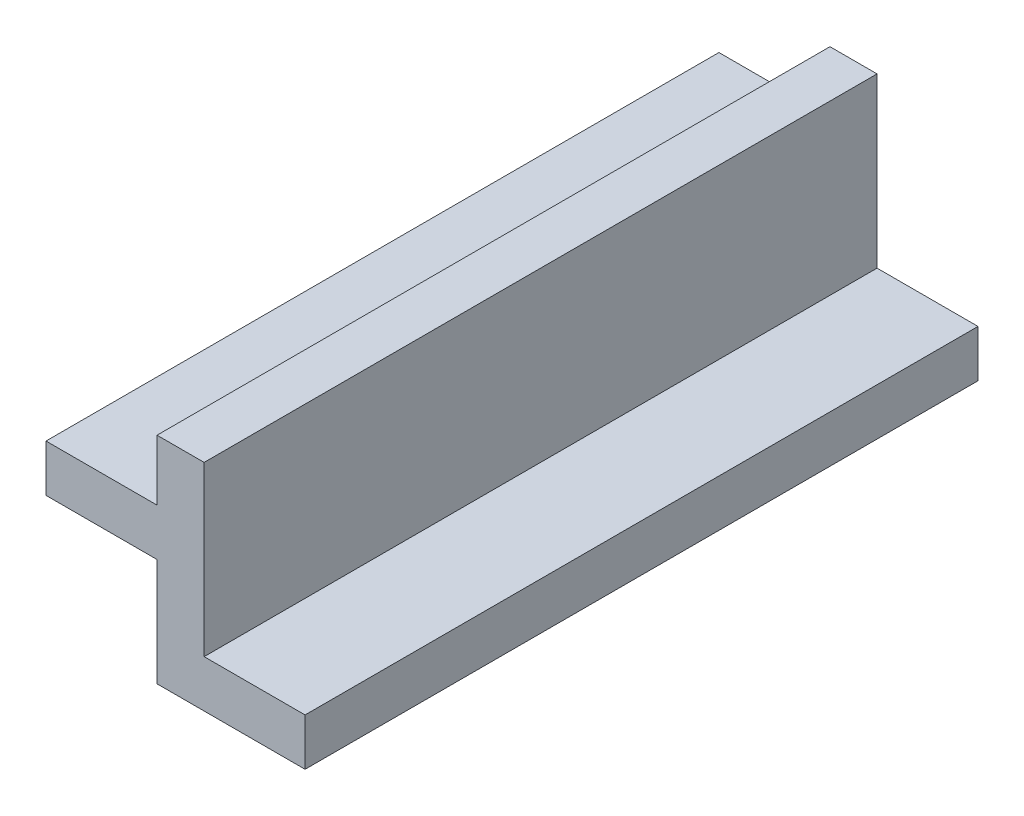
ISO-10303-21;
HEADER;
FILE_DESCRIPTION(('STEP AP214'),'2;1');
FILE_NAME('part.step','',(''),(''),'','','');
FILE_SCHEMA(('AUTOMOTIVE_DESIGN { 1 0 10303 214 1 1 1 1 }'));
ENDSEC;
DATA;
#1=APPLICATION_CONTEXT('core data for automotive mechanical design processes');
#2=APPLICATION_PROTOCOL_DEFINITION('international standard','automotive_design',2000,#1);
#3=PRODUCT_CONTEXT('',#1,'mechanical');
#4=PRODUCT('Part','Part','',(#3));
#5=PRODUCT_RELATED_PRODUCT_CATEGORY('part','',(#4));
#6=PRODUCT_DEFINITION_FORMATION('','',#4);
#7=PRODUCT_DEFINITION_CONTEXT('part definition',#1,'design');
#8=PRODUCT_DEFINITION('design','',#6,#7);
#9=PRODUCT_DEFINITION_SHAPE('','',#8);
#10=(LENGTH_UNIT() NAMED_UNIT(*) SI_UNIT(.MILLI.,.METRE.));
#11=(NAMED_UNIT(*) PLANE_ANGLE_UNIT() SI_UNIT($,.RADIAN.));
#12=(NAMED_UNIT(*) SI_UNIT($,.STERADIAN.) SOLID_ANGLE_UNIT());
#13=UNCERTAINTY_MEASURE_WITH_UNIT(LENGTH_MEASURE(1.E-05),#10,'distance_accuracy_value','');
#14=(GEOMETRIC_REPRESENTATION_CONTEXT(3) GLOBAL_UNCERTAINTY_ASSIGNED_CONTEXT((#13)) GLOBAL_UNIT_ASSIGNED_CONTEXT((#10,
#11,#12)) REPRESENTATION_CONTEXT('',''));
#15=CARTESIAN_POINT('',(0.,0.,0.));
#16=DIRECTION('',(0.,0.,1.));
#17=DIRECTION('',(1.,0.,0.));
#18=AXIS2_PLACEMENT_3D('',#15,#16,#17);
#19=CARTESIAN_POINT('',(-3.5,0.,100.));
#20=DIRECTION('',(-1.,0.,0.));
#21=DIRECTION('',(0.,0.,1.));
#22=AXIS2_PLACEMENT_3D('',#19,#20,#21);
#23=PLANE('',#22);
#24=DIRECTION('',(0.,1.,0.));
#25=VECTOR('',#24,1.);
#26=CARTESIAN_POINT('',(-3.5,0.,0.));
#27=LINE('',#26,#25);
#28=CARTESIAN_POINT('',(-3.5,7.,0.));
#29=VERTEX_POINT('',#28);
#30=CARTESIAN_POINT('',(-3.5,16.,0.));
#31=VERTEX_POINT('',#30);
#32=EDGE_CURVE('E143',#29,#31,#27,.T.);
#33=ORIENTED_EDGE('',*,*,#32,.F.);
#34=DIRECTION('',(0.,0.,-1.));
#35=VECTOR('',#34,1.);
#36=CARTESIAN_POINT('',(-3.5,7.,100.));
#37=LINE('',#36,#35);
#38=CARTESIAN_POINT('',(-3.5,7.,100.));
#39=VERTEX_POINT('',#38);
#40=EDGE_CURVE('E11',#39,#29,#37,.T.);
#41=ORIENTED_EDGE('',*,*,#40,.F.);
#42=DIRECTION('',(0.,1.,0.));
#43=VECTOR('',#42,1.);
#44=CARTESIAN_POINT('',(-3.5,0.,100.));
#45=LINE('',#44,#43);
#46=CARTESIAN_POINT('',(-3.5,16.,100.));
#47=VERTEX_POINT('',#46);
#48=EDGE_CURVE('E166',#39,#47,#45,.T.);
#49=ORIENTED_EDGE('',*,*,#48,.T.);
#50=DIRECTION('',(0.,0.,-1.));
#51=VECTOR('',#50,1.);
#52=CARTESIAN_POINT('',(-3.5,16.,100.));
#53=LINE('',#52,#51);
#54=EDGE_CURVE('E52',#47,#31,#53,.T.);
#55=ORIENTED_EDGE('',*,*,#54,.T.);
#56=EDGE_LOOP('',(#33,#41,#49,#55));
#57=FACE_BOUND('',#56,.T.);
#58=ADVANCED_FACE('F35',(#57),#23,.T.);
#59=CARTESIAN_POINT('',(0.,7.,100.));
#60=DIRECTION('',(0.,-1.,0.));
#61=DIRECTION('',(1.,0.,0.));
#62=AXIS2_PLACEMENT_3D('',#59,#60,#61);
#63=PLANE('',#62);
#64=DIRECTION('',(-1.,0.,0.));
#65=VECTOR('',#64,1.);
#66=CARTESIAN_POINT('',(0.,7.,0.));
#67=LINE('',#66,#65);
#68=CARTESIAN_POINT('',(-20.,7.,0.));
#69=VERTEX_POINT('',#68);
#70=EDGE_CURVE('E145',#29,#69,#67,.T.);
#71=ORIENTED_EDGE('',*,*,#70,.T.);
#72=DIRECTION('',(0.,0.,-1.));
#73=VECTOR('',#72,1.);
#74=CARTESIAN_POINT('',(-20.,7.,100.));
#75=LINE('',#74,#73);
#76=CARTESIAN_POINT('',(-20.,7.,100.));
#77=VERTEX_POINT('',#76);
#78=EDGE_CURVE('E44',#77,#69,#75,.T.);
#79=ORIENTED_EDGE('',*,*,#78,.F.);
#80=DIRECTION('',(-1.,0.,0.));
#81=VECTOR('',#80,1.);
#82=CARTESIAN_POINT('',(0.,7.,100.));
#83=LINE('',#82,#81);
#84=EDGE_CURVE('E200',#39,#77,#83,.T.);
#85=ORIENTED_EDGE('',*,*,#84,.F.);
#86=ORIENTED_EDGE('',*,*,#40,.T.);
#87=EDGE_LOOP('',(#71,#79,#85,#86));
#88=FACE_BOUND('',#87,.T.);
#89=ADVANCED_FACE('F37',(#88),#63,.F.);
#90=CARTESIAN_POINT('',(-20.,0.,100.));
#91=DIRECTION('',(-1.,0.,0.));
#92=DIRECTION('',(0.,0.,1.));
#93=AXIS2_PLACEMENT_3D('',#90,#91,#92);
#94=PLANE('',#93);
#95=DIRECTION('',(0.,1.,0.));
#96=VECTOR('',#95,1.);
#97=CARTESIAN_POINT('',(-20.,0.,0.));
#98=LINE('',#97,#96);
#99=CARTESIAN_POINT('',(-20.,0.,0.));
#100=VERTEX_POINT('',#99);
#101=EDGE_CURVE('E149',#100,#69,#98,.T.);
#102=ORIENTED_EDGE('',*,*,#101,.F.);
#103=DIRECTION('',(0.,0.,-1.));
#104=VECTOR('',#103,1.);
#105=CARTESIAN_POINT('',(-20.,0.,100.));
#106=LINE('',#105,#104);
#107=CARTESIAN_POINT('',(-20.,0.,100.));
#108=VERTEX_POINT('',#107);
#109=EDGE_CURVE('E177',#108,#100,#106,.T.);
#110=ORIENTED_EDGE('',*,*,#109,.F.);
#111=DIRECTION('',(0.,1.,0.));
#112=VECTOR('',#111,1.);
#113=CARTESIAN_POINT('',(-20.,0.,100.));
#114=LINE('',#113,#112);
#115=EDGE_CURVE('E184',#108,#77,#114,.T.);
#116=ORIENTED_EDGE('',*,*,#115,.T.);
#117=ORIENTED_EDGE('',*,*,#78,.T.);
#118=EDGE_LOOP('',(#102,#110,#116,#117));
#119=FACE_BOUND('',#118,.T.);
#120=ADVANCED_FACE('F182',(#119),#94,.T.);
#121=CARTESIAN_POINT('',(0.,0.,100.));
#122=DIRECTION('',(0.,-1.,0.));
#123=DIRECTION('',(1.,0.,0.));
#124=AXIS2_PLACEMENT_3D('',#121,#122,#123);
#125=PLANE('',#124);
#126=DIRECTION('',(-1.,0.,0.));
#127=VECTOR('',#126,1.);
#128=CARTESIAN_POINT('',(0.,0.,0.));
#129=LINE('',#128,#127);
#130=CARTESIAN_POINT('',(-3.5,0.,0.));
#131=VERTEX_POINT('',#130);
#132=EDGE_CURVE('E152',#131,#100,#129,.T.);
#133=ORIENTED_EDGE('',*,*,#132,.F.);
#134=DIRECTION('',(0.,0.,-1.));
#135=VECTOR('',#134,1.);
#136=CARTESIAN_POINT('',(-3.5,0.,100.));
#137=LINE('',#136,#135);
#138=CARTESIAN_POINT('',(-3.5,0.,100.));
#139=VERTEX_POINT('',#138);
#140=EDGE_CURVE('E175',#139,#131,#137,.T.);
#141=ORIENTED_EDGE('',*,*,#140,.F.);
#142=DIRECTION('',(-1.,0.,0.));
#143=VECTOR('',#142,1.);
#144=CARTESIAN_POINT('',(0.,0.,100.));
#145=LINE('',#144,#143);
#146=EDGE_CURVE('E197',#139,#108,#145,.T.);
#147=ORIENTED_EDGE('',*,*,#146,.T.);
#148=ORIENTED_EDGE('',*,*,#109,.T.);
#149=EDGE_LOOP('',(#133,#141,#147,#148));
#150=FACE_BOUND('',#149,.T.);
#151=ADVANCED_FACE('F194',(#150),#125,.T.);
#152=CARTESIAN_POINT('',(-3.5,-16.,0.));
#153=VERTEX_POINT('',#152);
#154=EDGE_CURVE('E146',#153,#131,#27,.T.);
#155=ORIENTED_EDGE('',*,*,#154,.F.);
#156=DIRECTION('',(0.,0.,-1.));
#157=VECTOR('',#156,1.);
#158=CARTESIAN_POINT('',(-3.5,-16.,100.));
#159=LINE('',#158,#157);
#160=CARTESIAN_POINT('',(-3.5,-16.,100.));
#161=VERTEX_POINT('',#160);
#162=EDGE_CURVE('E173',#161,#153,#159,.T.);
#163=ORIENTED_EDGE('',*,*,#162,.F.);
#164=EDGE_CURVE('E202',#161,#139,#45,.T.);
#165=ORIENTED_EDGE('',*,*,#164,.T.);
#166=ORIENTED_EDGE('',*,*,#140,.T.);
#167=EDGE_LOOP('',(#155,#163,#165,#166));
#168=FACE_BOUND('',#167,.T.);
#169=ADVANCED_FACE('F221',(#168),#23,.T.);
#170=CARTESIAN_POINT('',(0.,-16.,100.));
#171=DIRECTION('',(0.,1.,0.));
#172=DIRECTION('',(0.,0.,1.));
#173=AXIS2_PLACEMENT_3D('',#170,#171,#172);
#174=PLANE('',#173);
#175=DIRECTION('',(1.,0.,0.));
#176=VECTOR('',#175,1.);
#177=CARTESIAN_POINT('',(0.,-16.,0.));
#178=LINE('',#177,#176);
#179=CARTESIAN_POINT('',(18.5,-16.,0.));
#180=VERTEX_POINT('',#179);
#181=EDGE_CURVE('E155',#153,#180,#178,.T.);
#182=ORIENTED_EDGE('',*,*,#181,.T.);
#183=DIRECTION('',(0.,0.,-1.));
#184=VECTOR('',#183,1.);
#185=CARTESIAN_POINT('',(18.5,-16.,100.));
#186=LINE('',#185,#184);
#187=CARTESIAN_POINT('',(18.5,-16.,100.));
#188=VERTEX_POINT('',#187);
#189=EDGE_CURVE('E170',#188,#180,#186,.T.);
#190=ORIENTED_EDGE('',*,*,#189,.F.);
#191=DIRECTION('',(1.,0.,0.));
#192=VECTOR('',#191,1.);
#193=CARTESIAN_POINT('',(0.,-16.,100.));
#194=LINE('',#193,#192);
#195=EDGE_CURVE('E138',#161,#188,#194,.T.);
#196=ORIENTED_EDGE('',*,*,#195,.F.);
#197=ORIENTED_EDGE('',*,*,#162,.T.);
#198=EDGE_LOOP('',(#182,#190,#196,#197));
#199=FACE_BOUND('',#198,.T.);
#200=ADVANCED_FACE('F228',(#199),#174,.F.);
#201=CARTESIAN_POINT('',(18.5,0.,100.));
#202=DIRECTION('',(-1.,0.,0.));
#203=DIRECTION('',(0.,0.,1.));
#204=AXIS2_PLACEMENT_3D('',#201,#202,#203);
#205=PLANE('',#204);
#206=DIRECTION('',(0.,1.,0.));
#207=VECTOR('',#206,1.);
#208=CARTESIAN_POINT('',(18.5,0.,0.));
#209=LINE('',#208,#207);
#210=CARTESIAN_POINT('',(18.5,-9.,0.));
#211=VERTEX_POINT('',#210);
#212=EDGE_CURVE('E157',#180,#211,#209,.T.);
#213=ORIENTED_EDGE('',*,*,#212,.T.);
#214=DIRECTION('',(0.,0.,-1.));
#215=VECTOR('',#214,1.);
#216=CARTESIAN_POINT('',(18.5,-9.,100.));
#217=LINE('',#216,#215);
#218=CARTESIAN_POINT('',(18.5,-9.,100.));
#219=VERTEX_POINT('',#218);
#220=EDGE_CURVE('E124',#219,#211,#217,.T.);
#221=ORIENTED_EDGE('',*,*,#220,.F.);
#222=DIRECTION('',(0.,1.,0.));
#223=VECTOR('',#222,1.);
#224=CARTESIAN_POINT('',(18.5,0.,100.));
#225=LINE('',#224,#223);
#226=EDGE_CURVE('E135',#188,#219,#225,.T.);
#227=ORIENTED_EDGE('',*,*,#226,.F.);
#228=ORIENTED_EDGE('',*,*,#189,.T.);
#229=EDGE_LOOP('',(#213,#221,#227,#228));
#230=FACE_BOUND('',#229,.T.);
#231=ADVANCED_FACE('F233',(#230),#205,.F.);
#232=CARTESIAN_POINT('',(0.,-9.,100.));
#233=DIRECTION('',(0.,1.,0.));
#234=DIRECTION('',(0.,0.,1.));
#235=AXIS2_PLACEMENT_3D('',#232,#233,#234);
#236=PLANE('',#235);
#237=DIRECTION('',(1.,0.,0.));
#238=VECTOR('',#237,1.);
#239=CARTESIAN_POINT('',(0.,-9.,0.));
#240=LINE('',#239,#238);
#241=CARTESIAN_POINT('',(3.5,-9.,0.));
#242=VERTEX_POINT('',#241);
#243=EDGE_CURVE('E121',#242,#211,#240,.T.);
#244=ORIENTED_EDGE('',*,*,#243,.F.);
#245=DIRECTION('',(0.,0.,-1.));
#246=VECTOR('',#245,1.);
#247=CARTESIAN_POINT('',(3.5,-9.,100.));
#248=LINE('',#247,#246);
#249=CARTESIAN_POINT('',(3.5,-9.,100.));
#250=VERTEX_POINT('',#249);
#251=EDGE_CURVE('E115',#250,#242,#248,.T.);
#252=ORIENTED_EDGE('',*,*,#251,.F.);
#253=DIRECTION('',(1.,0.,0.));
#254=VECTOR('',#253,1.);
#255=CARTESIAN_POINT('',(0.,-9.,100.));
#256=LINE('',#255,#254);
#257=EDGE_CURVE('E119',#250,#219,#256,.T.);
#258=ORIENTED_EDGE('',*,*,#257,.T.);
#259=ORIENTED_EDGE('',*,*,#220,.T.);
#260=EDGE_LOOP('',(#244,#252,#258,#259));
#261=FACE_BOUND('',#260,.T.);
#262=ADVANCED_FACE('F117',(#261),#236,.T.);
#263=CARTESIAN_POINT('',(3.5,0.,100.));
#264=DIRECTION('',(-1.,0.,0.));
#265=DIRECTION('',(0.,0.,1.));
#266=AXIS2_PLACEMENT_3D('',#263,#264,#265);
#267=PLANE('',#266);
#268=DIRECTION('',(0.,1.,0.));
#269=VECTOR('',#268,1.);
#270=CARTESIAN_POINT('',(3.5,0.,0.));
#271=LINE('',#270,#269);
#272=CARTESIAN_POINT('',(3.5,16.,0.));
#273=VERTEX_POINT('',#272);
#274=EDGE_CURVE('E161',#242,#273,#271,.T.);
#275=ORIENTED_EDGE('',*,*,#274,.T.);
#276=DIRECTION('',(0.,0.,-1.));
#277=VECTOR('',#276,1.);
#278=CARTESIAN_POINT('',(3.5,16.,100.));
#279=LINE('',#278,#277);
#280=CARTESIAN_POINT('',(3.5,16.,100.));
#281=VERTEX_POINT('',#280);
#282=EDGE_CURVE('E84',#281,#273,#279,.T.);
#283=ORIENTED_EDGE('',*,*,#282,.F.);
#284=DIRECTION('',(0.,1.,0.));
#285=VECTOR('',#284,1.);
#286=CARTESIAN_POINT('',(3.5,0.,100.));
#287=LINE('',#286,#285);
#288=EDGE_CURVE('E126',#250,#281,#287,.T.);
#289=ORIENTED_EDGE('',*,*,#288,.F.);
#290=ORIENTED_EDGE('',*,*,#251,.T.);
#291=EDGE_LOOP('',(#275,#283,#289,#290));
#292=FACE_BOUND('',#291,.T.);
#293=ADVANCED_FACE('F127',(#292),#267,.F.);
#294=CARTESIAN_POINT('',(0.,16.,100.));
#295=DIRECTION('',(0.,1.,0.));
#296=DIRECTION('',(0.,0.,1.));
#297=AXIS2_PLACEMENT_3D('',#294,#295,#296);
#298=PLANE('',#297);
#299=DIRECTION('',(1.,0.,0.));
#300=VECTOR('',#299,1.);
#301=CARTESIAN_POINT('',(0.,16.,0.));
#302=LINE('',#301,#300);
#303=EDGE_CURVE('E163',#31,#273,#302,.T.);
#304=ORIENTED_EDGE('',*,*,#303,.F.);
#305=ORIENTED_EDGE('',*,*,#54,.F.);
#306=DIRECTION('',(1.,0.,0.));
#307=VECTOR('',#306,1.);
#308=CARTESIAN_POINT('',(0.,16.,100.));
#309=LINE('',#308,#307);
#310=EDGE_CURVE('E130',#47,#281,#309,.T.);
#311=ORIENTED_EDGE('',*,*,#310,.T.);
#312=ORIENTED_EDGE('',*,*,#282,.T.);
#313=EDGE_LOOP('',(#304,#305,#311,#312));
#314=FACE_BOUND('',#313,.T.);
#315=ADVANCED_FACE('F209',(#314),#298,.T.);
#316=CARTESIAN_POINT('',(0.,0.,100.));
#317=DIRECTION('',(0.,0.,1.));
#318=DIRECTION('',(1.,0.,0.));
#319=AXIS2_PLACEMENT_3D('',#316,#317,#318);
#320=PLANE('',#319);
#321=ORIENTED_EDGE('',*,*,#48,.F.);
#322=ORIENTED_EDGE('',*,*,#84,.T.);
#323=ORIENTED_EDGE('',*,*,#115,.F.);
#324=ORIENTED_EDGE('',*,*,#146,.F.);
#325=ORIENTED_EDGE('',*,*,#164,.F.);
#326=ORIENTED_EDGE('',*,*,#195,.T.);
#327=ORIENTED_EDGE('',*,*,#226,.T.);
#328=ORIENTED_EDGE('',*,*,#257,.F.);
#329=ORIENTED_EDGE('',*,*,#288,.T.);
#330=ORIENTED_EDGE('',*,*,#310,.F.);
#331=EDGE_LOOP('',(#321,#322,#323,#324,#325,#326,#327,#328,#329,#330));
#332=FACE_BOUND('',#331,.T.);
#333=ADVANCED_FACE('F133',(#332),#320,.T.);
#334=CARTESIAN_POINT('',(0.,0.,0.));
#335=DIRECTION('',(0.,0.,1.));
#336=DIRECTION('',(1.,0.,0.));
#337=AXIS2_PLACEMENT_3D('',#334,#335,#336);
#338=PLANE('',#337);
#339=ORIENTED_EDGE('',*,*,#32,.T.);
#340=ORIENTED_EDGE('',*,*,#303,.T.);
#341=ORIENTED_EDGE('',*,*,#274,.F.);
#342=ORIENTED_EDGE('',*,*,#243,.T.);
#343=ORIENTED_EDGE('',*,*,#212,.F.);
#344=ORIENTED_EDGE('',*,*,#181,.F.);
#345=ORIENTED_EDGE('',*,*,#154,.T.);
#346=ORIENTED_EDGE('',*,*,#132,.T.);
#347=ORIENTED_EDGE('',*,*,#101,.T.);
#348=ORIENTED_EDGE('',*,*,#70,.F.);
#349=EDGE_LOOP('',(#339,#340,#341,#342,#343,#344,#345,#346,#347,#348));
#350=FACE_BOUND('',#349,.T.);
#351=ADVANCED_FACE('F188',(#350),#338,.F.);
#352=CLOSED_SHELL('',(#58,#89,#120,#151,#169,#200,#231,#262,#293,#315,#333,#351));
#353=MANIFOLD_SOLID_BREP('B2',#352);
#354=ADVANCED_BREP_SHAPE_REPRESENTATION('',(#18,#353),#14);
#355=SHAPE_DEFINITION_REPRESENTATION(#9,#354);
ENDSEC;
END-ISO-10303-21;
